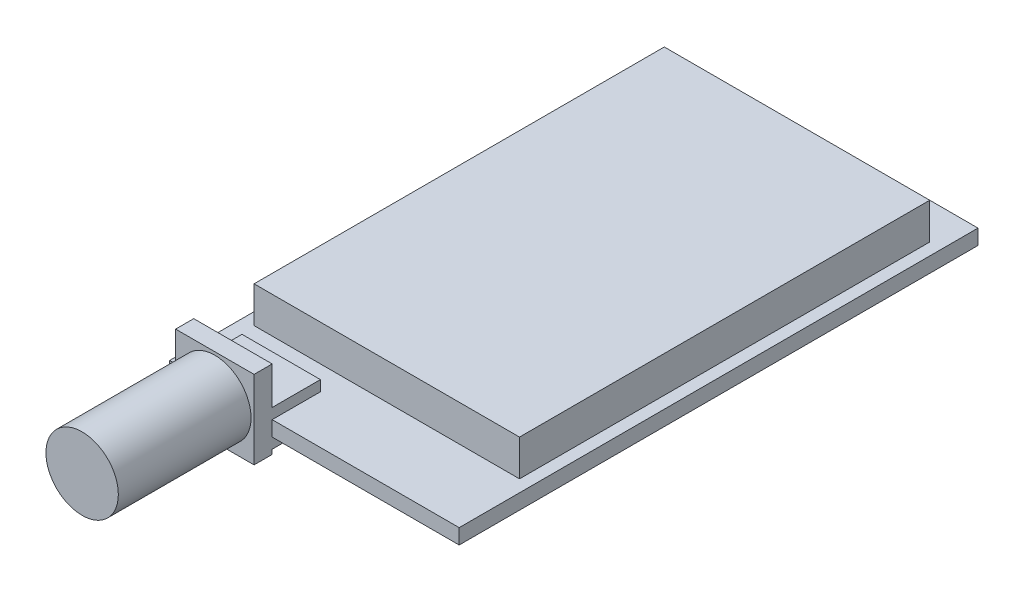
ISO-10303-21;
HEADER;
FILE_DESCRIPTION(('STEP AP214'),'2;1');
FILE_NAME('part.step','',(''),(''),'','','');
FILE_SCHEMA(('AUTOMOTIVE_DESIGN { 1 0 10303 214 1 1 1 1 }'));
ENDSEC;
DATA;
#1=APPLICATION_CONTEXT('core data for automotive mechanical design processes');
#2=APPLICATION_PROTOCOL_DEFINITION('international standard','automotive_design',2000,#1);
#3=PRODUCT_CONTEXT('',#1,'mechanical');
#4=PRODUCT('Part','Part','',(#3));
#5=PRODUCT_RELATED_PRODUCT_CATEGORY('part','',(#4));
#6=PRODUCT_DEFINITION_FORMATION('','',#4);
#7=PRODUCT_DEFINITION_CONTEXT('part definition',#1,'design');
#8=PRODUCT_DEFINITION('design','',#6,#7);
#9=PRODUCT_DEFINITION_SHAPE('','',#8);
#10=(LENGTH_UNIT() NAMED_UNIT(*) SI_UNIT(.MILLI.,.METRE.));
#11=(NAMED_UNIT(*) PLANE_ANGLE_UNIT() SI_UNIT($,.RADIAN.));
#12=(NAMED_UNIT(*) SI_UNIT($,.STERADIAN.) SOLID_ANGLE_UNIT());
#13=UNCERTAINTY_MEASURE_WITH_UNIT(LENGTH_MEASURE(1.E-05),#10,'distance_accuracy_value','');
#14=(GEOMETRIC_REPRESENTATION_CONTEXT(3) GLOBAL_UNCERTAINTY_ASSIGNED_CONTEXT((#13)) GLOBAL_UNIT_ASSIGNED_CONTEXT((#10,
#11,#12)) REPRESENTATION_CONTEXT('',''));
#15=CARTESIAN_POINT('',(0.,0.,0.));
#16=DIRECTION('',(0.,0.,1.));
#17=DIRECTION('',(1.,0.,0.));
#18=AXIS2_PLACEMENT_3D('',#15,#16,#17);
#19=CARTESIAN_POINT('',(0.,1.25,0.));
#20=DIRECTION('',(0.,1.,0.));
#21=DIRECTION('',(0.,0.,1.));
#22=AXIS2_PLACEMENT_3D('',#19,#20,#21);
#23=PLANE('',#22);
#24=DIRECTION('',(0.,0.,-1.));
#25=VECTOR('',#24,1.);
#26=CARTESIAN_POINT('',(11.,1.25,-18.5));
#27=LINE('',#26,#25);
#28=CARTESIAN_POINT('',(11.,1.25,15.5));
#29=VERTEX_POINT('',#28);
#30=CARTESIAN_POINT('',(11.,1.25,-18.5));
#31=VERTEX_POINT('',#30);
#32=EDGE_CURVE('E244',#29,#31,#27,.T.);
#33=ORIENTED_EDGE('',*,*,#32,.F.);
#34=DIRECTION('',(1.,0.,0.));
#35=VECTOR('',#34,1.);
#36=CARTESIAN_POINT('',(-11.,1.25,15.5));
#37=LINE('',#36,#35);
#38=CARTESIAN_POINT('',(-11.,1.25,15.5));
#39=VERTEX_POINT('',#38);
#40=EDGE_CURVE('E249',#39,#29,#37,.T.);
#41=ORIENTED_EDGE('',*,*,#40,.F.);
#42=DIRECTION('',(0.,0.,1.));
#43=VECTOR('',#42,1.);
#44=CARTESIAN_POINT('',(-11.,1.25,-18.5));
#45=LINE('',#44,#43);
#46=CARTESIAN_POINT('',(-11.,1.25,-18.5));
#47=VERTEX_POINT('',#46);
#48=EDGE_CURVE('E261',#47,#39,#45,.T.);
#49=ORIENTED_EDGE('',*,*,#48,.F.);
#50=DIRECTION('',(-1.,0.,0.));
#51=VECTOR('',#50,1.);
#52=CARTESIAN_POINT('',(-11.,1.25,-18.5));
#53=LINE('',#52,#51);
#54=EDGE_CURVE('E258',#31,#47,#53,.T.);
#55=ORIENTED_EDGE('',*,*,#54,.F.);
#56=EDGE_LOOP('',(#33,#41,#49,#55));
#57=FACE_BOUND('',#56,.T.);
#58=DIRECTION('',(1.,0.,0.));
#59=VECTOR('',#58,1.);
#60=CARTESIAN_POINT('',(-12.,1.25,21.5));
#61=LINE('',#60,#59);
#62=CARTESIAN_POINT('',(-12.,1.25,21.5));
#63=VERTEX_POINT('',#62);
#64=CARTESIAN_POINT('',(-10.,1.25,21.5));
#65=VERTEX_POINT('',#64);
#66=EDGE_CURVE('E287',#63,#65,#61,.T.);
#67=ORIENTED_EDGE('',*,*,#66,.T.);
#68=DIRECTION('',(0.,0.,-1.));
#69=VECTOR('',#68,1.);
#70=CARTESIAN_POINT('',(-10.,1.25,0.));
#71=LINE('',#70,#69);
#72=CARTESIAN_POINT('',(-10.,1.25,17.5));
#73=VERTEX_POINT('',#72);
#74=EDGE_CURVE('E204',#65,#73,#71,.T.);
#75=ORIENTED_EDGE('',*,*,#74,.T.);
#76=DIRECTION('',(-1.,0.,0.));
#77=VECTOR('',#76,1.);
#78=CARTESIAN_POINT('',(0.,1.25,17.5));
#79=LINE('',#78,#77);
#80=CARTESIAN_POINT('',(-3.5,1.25,17.5));
#81=VERTEX_POINT('',#80);
#82=EDGE_CURVE('E176',#81,#73,#79,.T.);
#83=ORIENTED_EDGE('',*,*,#82,.F.);
#84=DIRECTION('',(0.,0.,1.));
#85=VECTOR('',#84,1.);
#86=CARTESIAN_POINT('',(-3.5,1.25,0.));
#87=LINE('',#86,#85);
#88=CARTESIAN_POINT('',(-3.5,1.25,21.5));
#89=VERTEX_POINT('',#88);
#90=EDGE_CURVE('E195',#81,#89,#87,.T.);
#91=ORIENTED_EDGE('',*,*,#90,.T.);
#92=CARTESIAN_POINT('',(12.,1.25,21.5));
#93=VERTEX_POINT('',#92);
#94=EDGE_CURVE('E286',#89,#93,#61,.T.);
#95=ORIENTED_EDGE('',*,*,#94,.T.);
#96=DIRECTION('',(0.,0.,-1.));
#97=VECTOR('',#96,1.);
#98=CARTESIAN_POINT('',(12.,1.25,-21.5));
#99=LINE('',#98,#97);
#100=CARTESIAN_POINT('',(12.,1.25,-21.5));
#101=VERTEX_POINT('',#100);
#102=EDGE_CURVE('E278',#93,#101,#99,.T.);
#103=ORIENTED_EDGE('',*,*,#102,.T.);
#104=DIRECTION('',(-1.,0.,0.));
#105=VECTOR('',#104,1.);
#106=CARTESIAN_POINT('',(-12.,1.25,-21.5));
#107=LINE('',#106,#105);
#108=CARTESIAN_POINT('',(-12.,1.25,-21.5));
#109=VERTEX_POINT('',#108);
#110=EDGE_CURVE('E281',#101,#109,#107,.T.);
#111=ORIENTED_EDGE('',*,*,#110,.T.);
#112=DIRECTION('',(0.,0.,1.));
#113=VECTOR('',#112,1.);
#114=CARTESIAN_POINT('',(-12.,1.25,-21.5));
#115=LINE('',#114,#113);
#116=EDGE_CURVE('E284',#109,#63,#115,.T.);
#117=ORIENTED_EDGE('',*,*,#116,.T.);
#118=EDGE_LOOP('',(#67,#75,#83,#91,#95,#103,#111,#117));
#119=FACE_BOUND('',#118,.T.);
#120=ADVANCED_FACE('F32',(#57,#119),#23,.T.);
#121=CARTESIAN_POINT('',(0.,0.,0.));
#122=DIRECTION('',(0.,1.,0.));
#123=DIRECTION('',(0.,0.,1.));
#124=AXIS2_PLACEMENT_3D('',#121,#122,#123);
#125=PLANE('',#124);
#126=DIRECTION('',(0.,0.,-1.));
#127=VECTOR('',#126,1.);
#128=CARTESIAN_POINT('',(-10.,0.,0.));
#129=LINE('',#128,#127);
#130=CARTESIAN_POINT('',(-10.,0.,21.5));
#131=VERTEX_POINT('',#130);
#132=CARTESIAN_POINT('',(-10.,0.,17.5));
#133=VERTEX_POINT('',#132);
#134=EDGE_CURVE('E202',#131,#133,#129,.T.);
#135=ORIENTED_EDGE('',*,*,#134,.F.);
#136=DIRECTION('',(1.,0.,0.));
#137=VECTOR('',#136,1.);
#138=CARTESIAN_POINT('',(-12.,0.,21.5));
#139=LINE('',#138,#137);
#140=CARTESIAN_POINT('',(-12.,0.,21.5));
#141=VERTEX_POINT('',#140);
#142=EDGE_CURVE('E282',#141,#131,#139,.T.);
#143=ORIENTED_EDGE('',*,*,#142,.F.);
#144=DIRECTION('',(0.,0.,1.));
#145=VECTOR('',#144,1.);
#146=CARTESIAN_POINT('',(-12.,0.,-21.5));
#147=LINE('',#146,#145);
#148=CARTESIAN_POINT('',(-12.,0.,-21.5));
#149=VERTEX_POINT('',#148);
#150=EDGE_CURVE('E295',#149,#141,#147,.T.);
#151=ORIENTED_EDGE('',*,*,#150,.F.);
#152=DIRECTION('',(-1.,0.,0.));
#153=VECTOR('',#152,1.);
#154=CARTESIAN_POINT('',(-12.,0.,-21.5));
#155=LINE('',#154,#153);
#156=CARTESIAN_POINT('',(12.,0.,-21.5));
#157=VERTEX_POINT('',#156);
#158=EDGE_CURVE('E293',#157,#149,#155,.T.);
#159=ORIENTED_EDGE('',*,*,#158,.F.);
#160=DIRECTION('',(0.,0.,-1.));
#161=VECTOR('',#160,1.);
#162=CARTESIAN_POINT('',(12.,0.,-21.5));
#163=LINE('',#162,#161);
#164=CARTESIAN_POINT('',(12.,0.,21.5));
#165=VERTEX_POINT('',#164);
#166=EDGE_CURVE('E277',#165,#157,#163,.T.);
#167=ORIENTED_EDGE('',*,*,#166,.F.);
#168=CARTESIAN_POINT('',(-3.5,0.,21.5));
#169=VERTEX_POINT('',#168);
#170=EDGE_CURVE('E297',#169,#165,#139,.T.);
#171=ORIENTED_EDGE('',*,*,#170,.F.);
#172=DIRECTION('',(0.,0.,1.));
#173=VECTOR('',#172,1.);
#174=CARTESIAN_POINT('',(-3.5,0.,0.));
#175=LINE('',#174,#173);
#176=CARTESIAN_POINT('',(-3.5,0.,17.5));
#177=VERTEX_POINT('',#176);
#178=EDGE_CURVE('E193',#177,#169,#175,.T.);
#179=ORIENTED_EDGE('',*,*,#178,.F.);
#180=DIRECTION('',(-1.,0.,0.));
#181=VECTOR('',#180,1.);
#182=CARTESIAN_POINT('',(0.,0.,17.5));
#183=LINE('',#182,#181);
#184=EDGE_CURVE('E11',#177,#133,#183,.T.);
#185=ORIENTED_EDGE('',*,*,#184,.T.);
#186=EDGE_LOOP('',(#135,#143,#151,#159,#167,#171,#179,#185));
#187=FACE_BOUND('',#186,.T.);
#188=ADVANCED_FACE('F355',(#187),#125,.F.);
#189=CARTESIAN_POINT('',(0.,0.,21.5));
#190=DIRECTION('',(0.,0.,1.));
#191=DIRECTION('',(1.,0.,0.));
#192=AXIS2_PLACEMENT_3D('',#189,#190,#191);
#193=PLANE('',#192);
#194=DIRECTION('',(-1.,0.,0.));
#195=VECTOR('',#194,1.);
#196=CARTESIAN_POINT('',(-3.5,-0.875,21.5));
#197=LINE('',#196,#195);
#198=CARTESIAN_POINT('',(-3.5,-0.875,21.5));
#199=VERTEX_POINT('',#198);
#200=CARTESIAN_POINT('',(-10.,-0.874999999999998,21.5));
#201=VERTEX_POINT('',#200);
#202=EDGE_CURVE('E180',#199,#201,#197,.T.);
#203=ORIENTED_EDGE('',*,*,#202,.F.);
#204=DIRECTION('',(0.,1.,0.));
#205=VECTOR('',#204,1.);
#206=CARTESIAN_POINT('',(-3.5,5.25,21.5));
#207=LINE('',#206,#205);
#208=CARTESIAN_POINT('',(-3.5,-1.25,21.5));
#209=VERTEX_POINT('',#208);
#210=EDGE_CURVE('E225',#209,#199,#207,.T.);
#211=ORIENTED_EDGE('',*,*,#210,.F.);
#212=DIRECTION('',(1.,0.,0.));
#213=VECTOR('',#212,1.);
#214=CARTESIAN_POINT('',(-10.,-1.25,21.5));
#215=LINE('',#214,#213);
#216=CARTESIAN_POINT('',(-10.,-1.25,21.5));
#217=VERTEX_POINT('',#216);
#218=EDGE_CURVE('E218',#217,#209,#215,.T.);
#219=ORIENTED_EDGE('',*,*,#218,.F.);
#220=DIRECTION('',(0.,-1.,0.));
#221=VECTOR('',#220,1.);
#222=CARTESIAN_POINT('',(-10.,5.25,21.5));
#223=LINE('',#222,#221);
#224=EDGE_CURVE('E230',#201,#217,#223,.T.);
#225=ORIENTED_EDGE('',*,*,#224,.F.);
#226=EDGE_LOOP('',(#203,#211,#219,#225));
#227=FACE_BOUND('',#226,.T.);
#228=ADVANCED_FACE('F325',(#227),#193,.F.);
#229=DIRECTION('',(1.,0.,0.));
#230=VECTOR('',#229,1.);
#231=CARTESIAN_POINT('',(-3.5,2.125,21.5));
#232=LINE('',#231,#230);
#233=CARTESIAN_POINT('',(-10.,2.125,21.5));
#234=VERTEX_POINT('',#233);
#235=CARTESIAN_POINT('',(-3.5,2.125,21.5));
#236=VERTEX_POINT('',#235);
#237=EDGE_CURVE('E340',#234,#236,#232,.T.);
#238=ORIENTED_EDGE('',*,*,#237,.F.);
#239=CARTESIAN_POINT('',(-10.,5.25,21.5));
#240=VERTEX_POINT('',#239);
#241=EDGE_CURVE('E192',#240,#234,#223,.T.);
#242=ORIENTED_EDGE('',*,*,#241,.F.);
#243=DIRECTION('',(-1.,0.,0.));
#244=VECTOR('',#243,1.);
#245=CARTESIAN_POINT('',(-10.,5.25,21.5));
#246=LINE('',#245,#244);
#247=CARTESIAN_POINT('',(-3.5,5.25,21.5));
#248=VERTEX_POINT('',#247);
#249=EDGE_CURVE('E228',#248,#240,#246,.T.);
#250=ORIENTED_EDGE('',*,*,#249,.F.);
#251=EDGE_CURVE('E210',#236,#248,#207,.T.);
#252=ORIENTED_EDGE('',*,*,#251,.F.);
#253=EDGE_LOOP('',(#238,#242,#250,#252));
#254=FACE_BOUND('',#253,.T.);
#255=ADVANCED_FACE('F338',(#254),#193,.F.);
#256=CARTESIAN_POINT('',(-12.,1.25,21.5));
#257=DIRECTION('',(0.,0.,-1.));
#258=DIRECTION('',(-1.,0.,0.));
#259=AXIS2_PLACEMENT_3D('',#256,#257,#258);
#260=PLANE('',#259);
#261=EDGE_CURVE('E213',#169,#89,#207,.T.);
#262=ORIENTED_EDGE('',*,*,#261,.F.);
#263=ORIENTED_EDGE('',*,*,#170,.T.);
#264=DIRECTION('',(0.,-1.,0.));
#265=VECTOR('',#264,1.);
#266=CARTESIAN_POINT('',(12.,1.25,21.5));
#267=LINE('',#266,#265);
#268=EDGE_CURVE('E290',#93,#165,#267,.T.);
#269=ORIENTED_EDGE('',*,*,#268,.F.);
#270=ORIENTED_EDGE('',*,*,#94,.F.);
#271=EDGE_LOOP('',(#262,#263,#269,#270));
#272=FACE_BOUND('',#271,.T.);
#273=ADVANCED_FACE('F362',(#272),#260,.F.);
#274=EDGE_CURVE('E232',#65,#131,#223,.T.);
#275=ORIENTED_EDGE('',*,*,#274,.F.);
#276=ORIENTED_EDGE('',*,*,#66,.F.);
#277=DIRECTION('',(0.,-1.,0.));
#278=VECTOR('',#277,1.);
#279=CARTESIAN_POINT('',(-12.,1.25,21.5));
#280=LINE('',#279,#278);
#281=EDGE_CURVE('E302',#63,#141,#280,.T.);
#282=ORIENTED_EDGE('',*,*,#281,.T.);
#283=ORIENTED_EDGE('',*,*,#142,.T.);
#284=EDGE_LOOP('',(#275,#276,#282,#283));
#285=FACE_BOUND('',#284,.T.);
#286=ADVANCED_FACE('F368',(#285),#260,.F.);
#287=CARTESIAN_POINT('',(12.,1.25,-21.5));
#288=DIRECTION('',(-1.,0.,0.));
#289=DIRECTION('',(0.,0.,1.));
#290=AXIS2_PLACEMENT_3D('',#287,#288,#289);
#291=PLANE('',#290);
#292=ORIENTED_EDGE('',*,*,#166,.T.);
#293=DIRECTION('',(0.,-1.,0.));
#294=VECTOR('',#293,1.);
#295=CARTESIAN_POINT('',(12.,1.25,-21.5));
#296=LINE('',#295,#294);
#297=EDGE_CURVE('E307',#101,#157,#296,.T.);
#298=ORIENTED_EDGE('',*,*,#297,.F.);
#299=ORIENTED_EDGE('',*,*,#102,.F.);
#300=ORIENTED_EDGE('',*,*,#268,.T.);
#301=EDGE_LOOP('',(#292,#298,#299,#300));
#302=FACE_BOUND('',#301,.T.);
#303=ADVANCED_FACE('F34',(#302),#291,.F.);
#304=CARTESIAN_POINT('',(-12.,1.25,-21.5));
#305=DIRECTION('',(0.,0.,1.));
#306=DIRECTION('',(1.,0.,0.));
#307=AXIS2_PLACEMENT_3D('',#304,#305,#306);
#308=PLANE('',#307);
#309=ORIENTED_EDGE('',*,*,#158,.T.);
#310=DIRECTION('',(0.,-1.,0.));
#311=VECTOR('',#310,1.);
#312=CARTESIAN_POINT('',(-12.,1.25,-21.5));
#313=LINE('',#312,#311);
#314=EDGE_CURVE('E305',#109,#149,#313,.T.);
#315=ORIENTED_EDGE('',*,*,#314,.F.);
#316=ORIENTED_EDGE('',*,*,#110,.F.);
#317=ORIENTED_EDGE('',*,*,#297,.T.);
#318=EDGE_LOOP('',(#309,#315,#316,#317));
#319=FACE_BOUND('',#318,.T.);
#320=ADVANCED_FACE('F375',(#319),#308,.F.);
#321=CARTESIAN_POINT('',(-12.,1.25,-21.5));
#322=DIRECTION('',(1.,0.,0.));
#323=DIRECTION('',(0.,0.,-1.));
#324=AXIS2_PLACEMENT_3D('',#321,#322,#323);
#325=PLANE('',#324);
#326=ORIENTED_EDGE('',*,*,#150,.T.);
#327=ORIENTED_EDGE('',*,*,#281,.F.);
#328=ORIENTED_EDGE('',*,*,#116,.F.);
#329=ORIENTED_EDGE('',*,*,#314,.T.);
#330=EDGE_LOOP('',(#326,#327,#328,#329));
#331=FACE_BOUND('',#330,.T.);
#332=ADVANCED_FACE('F372',(#331),#325,.F.);
#333=CARTESIAN_POINT('',(11.,4.25,-18.5));
#334=DIRECTION('',(-1.,0.,0.));
#335=DIRECTION('',(0.,0.,1.));
#336=AXIS2_PLACEMENT_3D('',#333,#334,#335);
#337=PLANE('',#336);
#338=ORIENTED_EDGE('',*,*,#32,.T.);
#339=DIRECTION('',(0.,-1.,0.));
#340=VECTOR('',#339,1.);
#341=CARTESIAN_POINT('',(11.,4.25,-18.5));
#342=LINE('',#341,#340);
#343=CARTESIAN_POINT('',(11.,4.25,-18.5));
#344=VERTEX_POINT('',#343);
#345=EDGE_CURVE('E274',#344,#31,#342,.T.);
#346=ORIENTED_EDGE('',*,*,#345,.F.);
#347=DIRECTION('',(0.,0.,-1.));
#348=VECTOR('',#347,1.);
#349=CARTESIAN_POINT('',(11.,4.25,-18.5));
#350=LINE('',#349,#348);
#351=CARTESIAN_POINT('',(11.,4.25,15.5));
#352=VERTEX_POINT('',#351);
#353=EDGE_CURVE('E245',#352,#344,#350,.T.);
#354=ORIENTED_EDGE('',*,*,#353,.F.);
#355=DIRECTION('',(0.,-1.,0.));
#356=VECTOR('',#355,1.);
#357=CARTESIAN_POINT('',(11.,4.25,15.5));
#358=LINE('',#357,#356);
#359=EDGE_CURVE('E255',#352,#29,#358,.T.);
#360=ORIENTED_EDGE('',*,*,#359,.T.);
#361=EDGE_LOOP('',(#338,#346,#354,#360));
#362=FACE_BOUND('',#361,.T.);
#363=ADVANCED_FACE('F381',(#362),#337,.F.);
#364=CARTESIAN_POINT('',(-11.,4.25,-18.5));
#365=DIRECTION('',(0.,0.,1.));
#366=DIRECTION('',(1.,0.,0.));
#367=AXIS2_PLACEMENT_3D('',#364,#365,#366);
#368=PLANE('',#367);
#369=ORIENTED_EDGE('',*,*,#54,.T.);
#370=DIRECTION('',(0.,-1.,0.));
#371=VECTOR('',#370,1.);
#372=CARTESIAN_POINT('',(-11.,4.25,-18.5));
#373=LINE('',#372,#371);
#374=CARTESIAN_POINT('',(-11.,4.25,-18.5));
#375=VERTEX_POINT('',#374);
#376=EDGE_CURVE('E271',#375,#47,#373,.T.);
#377=ORIENTED_EDGE('',*,*,#376,.F.);
#378=DIRECTION('',(-1.,0.,0.));
#379=VECTOR('',#378,1.);
#380=CARTESIAN_POINT('',(-11.,4.25,-18.5));
#381=LINE('',#380,#379);
#382=EDGE_CURVE('E248',#344,#375,#381,.T.);
#383=ORIENTED_EDGE('',*,*,#382,.F.);
#384=ORIENTED_EDGE('',*,*,#345,.T.);
#385=EDGE_LOOP('',(#369,#377,#383,#384));
#386=FACE_BOUND('',#385,.T.);
#387=ADVANCED_FACE('F425',(#386),#368,.F.);
#388=CARTESIAN_POINT('',(-11.,4.25,-18.5));
#389=DIRECTION('',(1.,0.,0.));
#390=DIRECTION('',(0.,0.,-1.));
#391=AXIS2_PLACEMENT_3D('',#388,#389,#390);
#392=PLANE('',#391);
#393=ORIENTED_EDGE('',*,*,#48,.T.);
#394=DIRECTION('',(0.,-1.,0.));
#395=VECTOR('',#394,1.);
#396=CARTESIAN_POINT('',(-11.,4.25,15.5));
#397=LINE('',#396,#395);
#398=CARTESIAN_POINT('',(-11.,4.25,15.5));
#399=VERTEX_POINT('',#398);
#400=EDGE_CURVE('E268',#399,#39,#397,.T.);
#401=ORIENTED_EDGE('',*,*,#400,.F.);
#402=DIRECTION('',(0.,0.,1.));
#403=VECTOR('',#402,1.);
#404=CARTESIAN_POINT('',(-11.,4.25,-18.5));
#405=LINE('',#404,#403);
#406=EDGE_CURVE('E251',#375,#399,#405,.T.);
#407=ORIENTED_EDGE('',*,*,#406,.F.);
#408=ORIENTED_EDGE('',*,*,#376,.T.);
#409=EDGE_LOOP('',(#393,#401,#407,#408));
#410=FACE_BOUND('',#409,.T.);
#411=ADVANCED_FACE('F422',(#410),#392,.F.);
#412=CARTESIAN_POINT('',(-11.,4.25,15.5));
#413=DIRECTION('',(0.,0.,-1.));
#414=DIRECTION('',(-1.,0.,0.));
#415=AXIS2_PLACEMENT_3D('',#412,#413,#414);
#416=PLANE('',#415);
#417=ORIENTED_EDGE('',*,*,#40,.T.);
#418=ORIENTED_EDGE('',*,*,#359,.F.);
#419=DIRECTION('',(1.,0.,0.));
#420=VECTOR('',#419,1.);
#421=CARTESIAN_POINT('',(-11.,4.25,15.5));
#422=LINE('',#421,#420);
#423=EDGE_CURVE('E253',#399,#352,#422,.T.);
#424=ORIENTED_EDGE('',*,*,#423,.F.);
#425=ORIENTED_EDGE('',*,*,#400,.T.);
#426=EDGE_LOOP('',(#417,#418,#424,#425));
#427=FACE_BOUND('',#426,.T.);
#428=ADVANCED_FACE('F418',(#427),#416,.F.);
#429=CARTESIAN_POINT('',(0.,4.25,0.));
#430=DIRECTION('',(0.,1.,0.));
#431=DIRECTION('',(0.,0.,1.));
#432=AXIS2_PLACEMENT_3D('',#429,#430,#431);
#433=PLANE('',#432);
#434=ORIENTED_EDGE('',*,*,#353,.T.);
#435=ORIENTED_EDGE('',*,*,#382,.T.);
#436=ORIENTED_EDGE('',*,*,#406,.T.);
#437=ORIENTED_EDGE('',*,*,#423,.T.);
#438=EDGE_LOOP('',(#434,#435,#436,#437));
#439=FACE_BOUND('',#438,.T.);
#440=ADVANCED_FACE('F415',(#439),#433,.T.);
#441=CARTESIAN_POINT('',(-3.5,5.25,23.));
#442=DIRECTION('',(-1.,0.,0.));
#443=DIRECTION('',(0.,0.,1.));
#444=AXIS2_PLACEMENT_3D('',#441,#442,#443);
#445=PLANE('',#444);
#446=ORIENTED_EDGE('',*,*,#210,.T.);
#447=DIRECTION('',(0.,0.,1.));
#448=VECTOR('',#447,1.);
#449=CARTESIAN_POINT('',(-3.5,-0.875,17.5));
#450=LINE('',#449,#448);
#451=CARTESIAN_POINT('',(-3.5,-0.875,17.5));
#452=VERTEX_POINT('',#451);
#453=EDGE_CURVE('E197',#452,#199,#450,.T.);
#454=ORIENTED_EDGE('',*,*,#453,.F.);
#455=DIRECTION('',(0.,-1.,0.));
#456=VECTOR('',#455,1.);
#457=CARTESIAN_POINT('',(-3.5,2.125,17.5));
#458=LINE('',#457,#456);
#459=EDGE_CURVE('E186',#177,#452,#458,.T.);
#460=ORIENTED_EDGE('',*,*,#459,.F.);
#461=ORIENTED_EDGE('',*,*,#178,.T.);
#462=ORIENTED_EDGE('',*,*,#261,.T.);
#463=ORIENTED_EDGE('',*,*,#90,.F.);
#464=CARTESIAN_POINT('',(-3.5,2.125,17.5));
#465=VERTEX_POINT('',#464);
#466=EDGE_CURVE('E351',#465,#81,#458,.T.);
#467=ORIENTED_EDGE('',*,*,#466,.F.);
#468=DIRECTION('',(0.,0.,1.));
#469=VECTOR('',#468,1.);
#470=CARTESIAN_POINT('',(-3.5,2.125,17.5));
#471=LINE('',#470,#469);
#472=EDGE_CURVE('E55',#465,#236,#471,.T.);
#473=ORIENTED_EDGE('',*,*,#472,.T.);
#474=ORIENTED_EDGE('',*,*,#251,.T.);
#475=DIRECTION('',(0.,0.,-1.));
#476=VECTOR('',#475,1.);
#477=CARTESIAN_POINT('',(-3.5,5.25,23.));
#478=LINE('',#477,#476);
#479=CARTESIAN_POINT('',(-3.5,5.25,23.));
#480=VERTEX_POINT('',#479);
#481=EDGE_CURVE('E241',#480,#248,#478,.T.);
#482=ORIENTED_EDGE('',*,*,#481,.F.);
#483=DIRECTION('',(0.,1.,0.));
#484=VECTOR('',#483,1.);
#485=CARTESIAN_POINT('',(-3.5,5.25,23.));
#486=LINE('',#485,#484);
#487=CARTESIAN_POINT('',(-3.5,-1.25,23.));
#488=VERTEX_POINT('',#487);
#489=EDGE_CURVE('E214',#488,#480,#486,.T.);
#490=ORIENTED_EDGE('',*,*,#489,.F.);
#491=DIRECTION('',(0.,0.,-1.));
#492=VECTOR('',#491,1.);
#493=CARTESIAN_POINT('',(-3.5,-1.25,23.));
#494=LINE('',#493,#492);
#495=EDGE_CURVE('E224',#488,#209,#494,.T.);
#496=ORIENTED_EDGE('',*,*,#495,.T.);
#497=EDGE_LOOP('',(#446,#454,#460,#461,#462,#463,#467,#473,#474,#482,#490,#496));
#498=FACE_BOUND('',#497,.T.);
#499=ADVANCED_FACE('F327',(#498),#445,.F.);
#500=CARTESIAN_POINT('',(-10.,5.25,23.));
#501=DIRECTION('',(0.,-1.,0.));
#502=DIRECTION('',(0.,0.,-1.));
#503=AXIS2_PLACEMENT_3D('',#500,#501,#502);
#504=PLANE('',#503);
#505=ORIENTED_EDGE('',*,*,#249,.T.);
#506=DIRECTION('',(0.,0.,-1.));
#507=VECTOR('',#506,1.);
#508=CARTESIAN_POINT('',(-10.,5.25,23.));
#509=LINE('',#508,#507);
#510=CARTESIAN_POINT('',(-10.,5.25,23.));
#511=VERTEX_POINT('',#510);
#512=EDGE_CURVE('E239',#511,#240,#509,.T.);
#513=ORIENTED_EDGE('',*,*,#512,.F.);
#514=DIRECTION('',(-1.,0.,0.));
#515=VECTOR('',#514,1.);
#516=CARTESIAN_POINT('',(-10.,5.25,23.));
#517=LINE('',#516,#515);
#518=EDGE_CURVE('E217',#480,#511,#517,.T.);
#519=ORIENTED_EDGE('',*,*,#518,.F.);
#520=ORIENTED_EDGE('',*,*,#481,.T.);
#521=EDGE_LOOP('',(#505,#513,#519,#520));
#522=FACE_BOUND('',#521,.T.);
#523=ADVANCED_FACE('F410',(#522),#504,.F.);
#524=CARTESIAN_POINT('',(-10.,5.25,23.));
#525=DIRECTION('',(1.,0.,0.));
#526=DIRECTION('',(0.,0.,-1.));
#527=AXIS2_PLACEMENT_3D('',#524,#525,#526);
#528=PLANE('',#527);
#529=ORIENTED_EDGE('',*,*,#241,.T.);
#530=DIRECTION('',(0.,0.,1.));
#531=VECTOR('',#530,1.);
#532=CARTESIAN_POINT('',(-10.,2.125,17.5));
#533=LINE('',#532,#531);
#534=CARTESIAN_POINT('',(-10.,2.125,17.5));
#535=VERTEX_POINT('',#534);
#536=EDGE_CURVE('E184',#535,#234,#533,.T.);
#537=ORIENTED_EDGE('',*,*,#536,.F.);
#538=DIRECTION('',(0.,1.,0.));
#539=VECTOR('',#538,1.);
#540=CARTESIAN_POINT('',(-10.,2.125,17.5));
#541=LINE('',#540,#539);
#542=EDGE_CURVE('E170',#73,#535,#541,.T.);
#543=ORIENTED_EDGE('',*,*,#542,.F.);
#544=ORIENTED_EDGE('',*,*,#74,.F.);
#545=ORIENTED_EDGE('',*,*,#274,.T.);
#546=ORIENTED_EDGE('',*,*,#134,.T.);
#547=CARTESIAN_POINT('',(-10.,-0.875,17.5));
#548=VERTEX_POINT('',#547);
#549=EDGE_CURVE('E179',#548,#133,#541,.T.);
#550=ORIENTED_EDGE('',*,*,#549,.F.);
#551=DIRECTION('',(0.,0.,1.));
#552=VECTOR('',#551,1.);
#553=CARTESIAN_POINT('',(-10.,-0.875,17.5));
#554=LINE('',#553,#552);
#555=EDGE_CURVE('E47',#548,#201,#554,.T.);
#556=ORIENTED_EDGE('',*,*,#555,.T.);
#557=ORIENTED_EDGE('',*,*,#224,.T.);
#558=DIRECTION('',(0.,0.,-1.));
#559=VECTOR('',#558,1.);
#560=CARTESIAN_POINT('',(-10.,-1.25,23.));
#561=LINE('',#560,#559);
#562=CARTESIAN_POINT('',(-10.,-1.25,23.));
#563=VERTEX_POINT('',#562);
#564=EDGE_CURVE('E236',#563,#217,#561,.T.);
#565=ORIENTED_EDGE('',*,*,#564,.F.);
#566=DIRECTION('',(0.,-1.,0.));
#567=VECTOR('',#566,1.);
#568=CARTESIAN_POINT('',(-10.,5.25,23.));
#569=LINE('',#568,#567);
#570=EDGE_CURVE('E220',#511,#563,#569,.T.);
#571=ORIENTED_EDGE('',*,*,#570,.F.);
#572=ORIENTED_EDGE('',*,*,#512,.T.);
#573=EDGE_LOOP('',(#529,#537,#543,#544,#545,#546,#550,#556,#557,#565,#571,#572));
#574=FACE_BOUND('',#573,.T.);
#575=ADVANCED_FACE('F189',(#574),#528,.F.);
#576=CARTESIAN_POINT('',(-10.,-1.25,23.));
#577=DIRECTION('',(0.,1.,0.));
#578=DIRECTION('',(-1.,0.,0.));
#579=AXIS2_PLACEMENT_3D('',#576,#577,#578);
#580=PLANE('',#579);
#581=ORIENTED_EDGE('',*,*,#218,.T.);
#582=ORIENTED_EDGE('',*,*,#495,.F.);
#583=DIRECTION('',(1.,0.,0.));
#584=VECTOR('',#583,1.);
#585=CARTESIAN_POINT('',(-10.,-1.25,23.));
#586=LINE('',#585,#584);
#587=EDGE_CURVE('E222',#563,#488,#586,.T.);
#588=ORIENTED_EDGE('',*,*,#587,.F.);
#589=ORIENTED_EDGE('',*,*,#564,.T.);
#590=EDGE_LOOP('',(#581,#582,#588,#589));
#591=FACE_BOUND('',#590,.T.);
#592=ADVANCED_FACE('F322',(#591),#580,.F.);
#593=CARTESIAN_POINT('',(0.,0.,23.));
#594=DIRECTION('',(0.,0.,1.));
#595=DIRECTION('',(1.,0.,0.));
#596=AXIS2_PLACEMENT_3D('',#593,#594,#595);
#597=PLANE('',#596);
#598=CARTESIAN_POINT('',(-6.75,2.,23.));
#599=DIRECTION('',(0.,0.,1.));
#600=DIRECTION('',(1.,0.,0.));
#601=AXIS2_PLACEMENT_3D('',#598,#599,#600);
#602=CIRCLE('',#601,3.);
#603=CARTESIAN_POINT('',(-3.75,2.,23.));
#604=VERTEX_POINT('',#603);
#605=EDGE_CURVE('E40',#604,#604,#602,.T.);
#606=ORIENTED_EDGE('',*,*,#605,.F.);
#607=EDGE_LOOP('',(#606));
#608=FACE_BOUND('',#607,.T.);
#609=ORIENTED_EDGE('',*,*,#489,.T.);
#610=ORIENTED_EDGE('',*,*,#518,.T.);
#611=ORIENTED_EDGE('',*,*,#570,.T.);
#612=ORIENTED_EDGE('',*,*,#587,.T.);
#613=EDGE_LOOP('',(#609,#610,#611,#612));
#614=FACE_BOUND('',#613,.T.);
#615=ADVANCED_FACE('F333',(#608,#614),#597,.T.);
#616=CARTESIAN_POINT('',(-6.75,2.,34.));
#617=DIRECTION('',(0.,0.,-1.));
#618=DIRECTION('',(-1.,0.,0.));
#619=AXIS2_PLACEMENT_3D('',#616,#617,#618);
#620=CYLINDRICAL_SURFACE('',#619,3.);
#621=CARTESIAN_POINT('',(-6.75,2.,34.));
#622=DIRECTION('',(0.,0.,1.));
#623=DIRECTION('',(1.,0.,0.));
#624=AXIS2_PLACEMENT_3D('',#621,#622,#623);
#625=CIRCLE('',#624,3.);
#626=CARTESIAN_POINT('',(-3.75,2.,34.));
#627=VERTEX_POINT('',#626);
#628=EDGE_CURVE('E207',#627,#627,#625,.T.);
#629=ORIENTED_EDGE('',*,*,#628,.F.);
#630=EDGE_LOOP('',(#629));
#631=FACE_BOUND('',#630,.T.);
#632=ORIENTED_EDGE('',*,*,#605,.T.);
#633=EDGE_LOOP('',(#632));
#634=FACE_BOUND('',#633,.T.);
#635=ADVANCED_FACE('F518',(#631,#634),#620,.T.);
#636=CARTESIAN_POINT('',(-6.75,2.,34.));
#637=DIRECTION('',(0.,0.,1.));
#638=DIRECTION('',(1.,0.,0.));
#639=AXIS2_PLACEMENT_3D('',#636,#637,#638);
#640=PLANE('',#639);
#641=ORIENTED_EDGE('',*,*,#628,.T.);
#642=EDGE_LOOP('',(#641));
#643=FACE_BOUND('',#642,.T.);
#644=ADVANCED_FACE('F489',(#643),#640,.T.);
#645=CARTESIAN_POINT('',(-3.5,2.125,17.5));
#646=DIRECTION('',(0.,-1.,0.));
#647=DIRECTION('',(0.,0.,-1.));
#648=AXIS2_PLACEMENT_3D('',#645,#646,#647);
#649=PLANE('',#648);
#650=ORIENTED_EDGE('',*,*,#237,.T.);
#651=ORIENTED_EDGE('',*,*,#472,.F.);
#652=DIRECTION('',(1.,0.,0.));
#653=VECTOR('',#652,1.);
#654=CARTESIAN_POINT('',(-3.5,2.125,17.5));
#655=LINE('',#654,#653);
#656=EDGE_CURVE('E174',#535,#465,#655,.T.);
#657=ORIENTED_EDGE('',*,*,#656,.F.);
#658=ORIENTED_EDGE('',*,*,#536,.T.);
#659=EDGE_LOOP('',(#650,#651,#657,#658));
#660=FACE_BOUND('',#659,.T.);
#661=ADVANCED_FACE('F183',(#660),#649,.F.);
#662=CARTESIAN_POINT('',(0.,0.,17.5));
#663=DIRECTION('',(0.,0.,-1.));
#664=DIRECTION('',(-1.,0.,0.));
#665=AXIS2_PLACEMENT_3D('',#662,#663,#664);
#666=PLANE('',#665);
#667=ORIENTED_EDGE('',*,*,#466,.T.);
#668=ORIENTED_EDGE('',*,*,#82,.T.);
#669=ORIENTED_EDGE('',*,*,#542,.T.);
#670=ORIENTED_EDGE('',*,*,#656,.T.);
#671=EDGE_LOOP('',(#667,#668,#669,#670));
#672=FACE_BOUND('',#671,.T.);
#673=ADVANCED_FACE('F173',(#672),#666,.T.);
#674=ORIENTED_EDGE('',*,*,#184,.F.);
#675=ORIENTED_EDGE('',*,*,#459,.T.);
#676=DIRECTION('',(-1.,0.,0.));
#677=VECTOR('',#676,1.);
#678=CARTESIAN_POINT('',(-3.5,-0.875,17.5));
#679=LINE('',#678,#677);
#680=EDGE_CURVE('E344',#452,#548,#679,.T.);
#681=ORIENTED_EDGE('',*,*,#680,.T.);
#682=ORIENTED_EDGE('',*,*,#549,.T.);
#683=EDGE_LOOP('',(#674,#675,#681,#682));
#684=FACE_BOUND('',#683,.T.);
#685=ADVANCED_FACE('F352',(#684),#666,.T.);
#686=CARTESIAN_POINT('',(-3.5,-0.875,17.5));
#687=DIRECTION('',(0.,1.,0.));
#688=DIRECTION('',(0.,0.,1.));
#689=AXIS2_PLACEMENT_3D('',#686,#687,#688);
#690=PLANE('',#689);
#691=ORIENTED_EDGE('',*,*,#202,.T.);
#692=ORIENTED_EDGE('',*,*,#555,.F.);
#693=ORIENTED_EDGE('',*,*,#680,.F.);
#694=ORIENTED_EDGE('',*,*,#453,.T.);
#695=EDGE_LOOP('',(#691,#692,#693,#694));
#696=FACE_BOUND('',#695,.T.);
#697=ADVANCED_FACE('F348',(#696),#690,.F.);
#698=CLOSED_SHELL('',(#120,#188,#228,#255,#273,#286,#303,#320,#332,#363,#387,#411,#428,#440,
#499,#523,#575,#592,#615,#635,#644,#661,#673,#685,#697));
#699=MANIFOLD_SOLID_BREP('B2',#698);
#700=ADVANCED_BREP_SHAPE_REPRESENTATION('',(#18,#699),#14);
#701=SHAPE_DEFINITION_REPRESENTATION(#9,#700);
ENDSEC;
END-ISO-10303-21;
